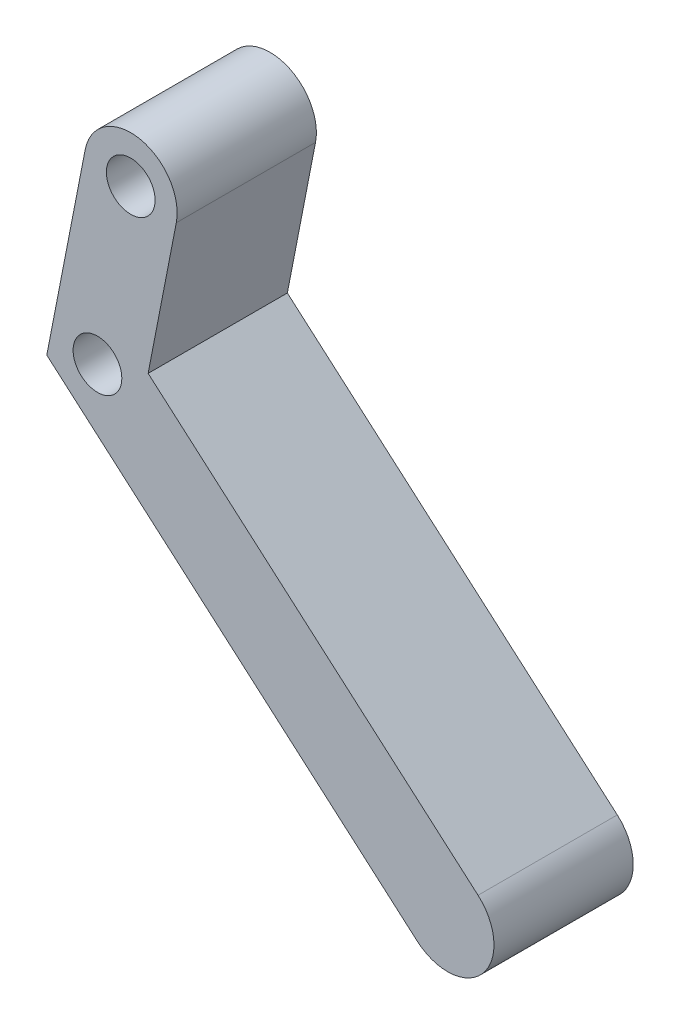
ISO-10303-21;
HEADER;
FILE_DESCRIPTION(('STEP AP214'),'2;1');
FILE_NAME('part.step','',(''),(''),'','','');
FILE_SCHEMA(('AUTOMOTIVE_DESIGN { 1 0 10303 214 1 1 1 1 }'));
ENDSEC;
DATA;
#1=APPLICATION_CONTEXT('core data for automotive mechanical design processes');
#2=APPLICATION_PROTOCOL_DEFINITION('international standard','automotive_design',2000,#1);
#3=PRODUCT_CONTEXT('',#1,'mechanical');
#4=PRODUCT('Part','Part','',(#3));
#5=PRODUCT_RELATED_PRODUCT_CATEGORY('part','',(#4));
#6=PRODUCT_DEFINITION_FORMATION('','',#4);
#7=PRODUCT_DEFINITION_CONTEXT('part definition',#1,'design');
#8=PRODUCT_DEFINITION('design','',#6,#7);
#9=PRODUCT_DEFINITION_SHAPE('','',#8);
#10=(LENGTH_UNIT() NAMED_UNIT(*) SI_UNIT(.MILLI.,.METRE.));
#11=(NAMED_UNIT(*) PLANE_ANGLE_UNIT() SI_UNIT($,.RADIAN.));
#12=(NAMED_UNIT(*) SI_UNIT($,.STERADIAN.) SOLID_ANGLE_UNIT());
#13=UNCERTAINTY_MEASURE_WITH_UNIT(LENGTH_MEASURE(1.E-05),#10,'distance_accuracy_value','');
#14=(GEOMETRIC_REPRESENTATION_CONTEXT(3) GLOBAL_UNCERTAINTY_ASSIGNED_CONTEXT((#13)) GLOBAL_UNIT_ASSIGNED_CONTEXT((#10,
#11,#12)) REPRESENTATION_CONTEXT('',''));
#15=CARTESIAN_POINT('',(0.,0.,0.));
#16=DIRECTION('',(0.,0.,1.));
#17=DIRECTION('',(1.,0.,0.));
#18=AXIS2_PLACEMENT_3D('',#15,#16,#17);
#19=CARTESIAN_POINT('',(80.6557787337688,-32.5877911499474,-6.));
#20=DIRECTION('',(-0.981551105812446,0.191199965163084,0.));
#21=DIRECTION('',(-0.191199965163084,-0.981551105812446,0.));
#22=AXIS2_PLACEMENT_3D('',#19,#20,#21);
#23=PLANE('',#22);
#24=DIRECTION('',(-0.191199965163084,-0.981551105812446,0.));
#25=VECTOR('',#24,1.);
#26=CARTESIAN_POINT('',(80.6557787337688,-32.5877911499474,0.));
#27=LINE('',#26,#25);
#28=CARTESIAN_POINT('',(80.6557787337688,-32.5877911499474,0.));
#29=VERTEX_POINT('',#28);
#30=CARTESIAN_POINT('',(79.0010002923337,-41.0828220338692,0.));
#31=VERTEX_POINT('',#30);
#32=EDGE_CURVE('E120',#29,#31,#27,.T.);
#33=ORIENTED_EDGE('',*,*,#32,.F.);
#34=DIRECTION('',(0.,0.,1.));
#35=VECTOR('',#34,1.);
#36=CARTESIAN_POINT('',(80.6557787337688,-32.5877911499474,-6.));
#37=LINE('',#36,#35);
#38=CARTESIAN_POINT('',(80.6557787337688,-32.5877911499474,-6.));
#39=VERTEX_POINT('',#38);
#40=EDGE_CURVE('E11',#39,#29,#37,.T.);
#41=ORIENTED_EDGE('',*,*,#40,.F.);
#42=DIRECTION('',(-0.191199965163084,-0.981551105812446,0.));
#43=VECTOR('',#42,1.);
#44=CARTESIAN_POINT('',(80.6557787337688,-32.5877911499474,-6.));
#45=LINE('',#44,#43);
#46=CARTESIAN_POINT('',(79.0010002923337,-41.0828220338692,-6.));
#47=VERTEX_POINT('',#46);
#48=EDGE_CURVE('E135',#39,#47,#45,.T.);
#49=ORIENTED_EDGE('',*,*,#48,.T.);
#50=DIRECTION('',(0.,0.,1.));
#51=VECTOR('',#50,1.);
#52=CARTESIAN_POINT('',(79.0010002923337,-41.0828220338692,-6.));
#53=LINE('',#52,#51);
#54=EDGE_CURVE('E84',#47,#31,#53,.T.);
#55=ORIENTED_EDGE('',*,*,#54,.T.);
#56=EDGE_LOOP('',(#33,#41,#49,#55));
#57=FACE_BOUND('',#56,.T.);
#58=ADVANCED_FACE('F34',(#57),#23,.T.);
#59=CARTESIAN_POINT('',(82.6188809453937,-32.9701910802736,-6.));
#60=DIRECTION('',(0.,0.,1.));
#61=DIRECTION('',(1.,0.,0.));
#62=AXIS2_PLACEMENT_3D('',#59,#60,#61);
#63=CYLINDRICAL_SURFACE('',#62,2.);
#64=CARTESIAN_POINT('',(82.6188809453937,-32.9701910802736,0.));
#65=DIRECTION('',(0.,0.,1.));
#66=DIRECTION('',(1.,0.,0.));
#67=AXIS2_PLACEMENT_3D('',#64,#65,#66);
#68=CIRCLE('',#67,2.);
#69=CARTESIAN_POINT('',(84.5819831570186,-33.3525910105998,0.));
#70=VERTEX_POINT('',#69);
#71=EDGE_CURVE('E133',#70,#29,#68,.T.);
#72=ORIENTED_EDGE('',*,*,#71,.F.);
#73=DIRECTION('',(0.,0.,1.));
#74=VECTOR('',#73,1.);
#75=CARTESIAN_POINT('',(84.5819831570186,-33.3525910105998,-6.));
#76=LINE('',#75,#74);
#77=CARTESIAN_POINT('',(84.5819831570186,-33.3525910105998,-6.));
#78=VERTEX_POINT('',#77);
#79=EDGE_CURVE('E43',#78,#70,#76,.T.);
#80=ORIENTED_EDGE('',*,*,#79,.F.);
#81=CARTESIAN_POINT('',(82.6188809453937,-32.9701910802736,-6.));
#82=DIRECTION('',(0.,0.,1.));
#83=DIRECTION('',(1.,0.,0.));
#84=AXIS2_PLACEMENT_3D('',#81,#82,#83);
#85=CIRCLE('',#84,2.);
#86=EDGE_CURVE('E110',#78,#39,#85,.T.);
#87=ORIENTED_EDGE('',*,*,#86,.T.);
#88=ORIENTED_EDGE('',*,*,#40,.T.);
#89=EDGE_LOOP('',(#72,#80,#87,#88));
#90=FACE_BOUND('',#89,.T.);
#91=ADVANCED_FACE('F158',(#90),#63,.T.);
#92=CARTESIAN_POINT('',(83.3687621210073,-39.5808267138648,-6.));
#93=DIRECTION('',(0.981551105812446,-0.191199965163083,0.));
#94=DIRECTION('',(0.191199965163083,0.981551105812446,0.));
#95=AXIS2_PLACEMENT_3D('',#92,#93,#94);
#96=PLANE('',#95);
#97=DIRECTION('',(0.191199965163083,0.981551105812446,0.));
#98=VECTOR('',#97,1.);
#99=CARTESIAN_POINT('',(83.3687621210073,-39.5808267138648,0.));
#100=LINE('',#99,#98);
#101=CARTESIAN_POINT('',(83.3687621210073,-39.5808267138648,0.));
#102=VERTEX_POINT('',#101);
#103=EDGE_CURVE('E97',#102,#70,#100,.T.);
#104=ORIENTED_EDGE('',*,*,#103,.F.);
#105=DIRECTION('',(0.,0.,1.));
#106=VECTOR('',#105,1.);
#107=CARTESIAN_POINT('',(83.3687621210073,-39.5808267138648,-6.));
#108=LINE('',#107,#106);
#109=CARTESIAN_POINT('',(83.3687621210073,-39.5808267138648,-6.));
#110=VERTEX_POINT('',#109);
#111=EDGE_CURVE('E92',#110,#102,#108,.T.);
#112=ORIENTED_EDGE('',*,*,#111,.F.);
#113=DIRECTION('',(0.191199965163083,0.981551105812446,0.));
#114=VECTOR('',#113,1.);
#115=CARTESIAN_POINT('',(83.3687621210073,-39.5808267138648,-6.));
#116=LINE('',#115,#114);
#117=EDGE_CURVE('E95',#110,#78,#116,.T.);
#118=ORIENTED_EDGE('',*,*,#117,.T.);
#119=ORIENTED_EDGE('',*,*,#79,.T.);
#120=EDGE_LOOP('',(#104,#112,#118,#119));
#121=FACE_BOUND('',#120,.T.);
#122=ADVANCED_FACE('F94',(#121),#96,.T.);
#123=CARTESIAN_POINT('',(97.5865645698457,-51.9501195523405,-6.));
#124=DIRECTION('',(0.656359579940151,0.754448210164746,0.));
#125=DIRECTION('',(-0.754448210164746,0.656359579940151,0.));
#126=AXIS2_PLACEMENT_3D('',#123,#124,#125);
#127=PLANE('',#126);
#128=DIRECTION('',(-0.754448210164746,0.656359579940151,0.));
#129=VECTOR('',#128,1.);
#130=CARTESIAN_POINT('',(97.5865645698457,-51.9501195523405,0.));
#131=LINE('',#130,#129);
#132=CARTESIAN_POINT('',(97.5865645698458,-51.9501195523405,0.));
#133=VERTEX_POINT('',#132);
#134=EDGE_CURVE('E130',#133,#102,#131,.T.);
#135=ORIENTED_EDGE('',*,*,#134,.F.);
#136=DIRECTION('',(0.,0.,1.));
#137=VECTOR('',#136,1.);
#138=CARTESIAN_POINT('',(97.5865645698458,-51.9501195523405,-6.));
#139=LINE('',#138,#137);
#140=CARTESIAN_POINT('',(97.5865645698458,-51.9501195523405,-6.));
#141=VERTEX_POINT('',#140);
#142=EDGE_CURVE('E102',#141,#133,#139,.T.);
#143=ORIENTED_EDGE('',*,*,#142,.F.);
#144=DIRECTION('',(-0.754448210164746,0.656359579940151,0.));
#145=VECTOR('',#144,1.);
#146=CARTESIAN_POINT('',(97.5865645698457,-51.9501195523405,-6.));
#147=LINE('',#146,#145);
#148=EDGE_CURVE('E108',#141,#110,#147,.T.);
#149=ORIENTED_EDGE('',*,*,#148,.T.);
#150=ORIENTED_EDGE('',*,*,#111,.T.);
#151=EDGE_LOOP('',(#135,#143,#149,#150));
#152=FACE_BOUND('',#151,.T.);
#153=ADVANCED_FACE('F112',(#152),#127,.T.);
#154=CARTESIAN_POINT('',(96.2738454099655,-53.45901597267,-6.));
#155=DIRECTION('',(0.,0.,1.));
#156=DIRECTION('',(1.,0.,0.));
#157=AXIS2_PLACEMENT_3D('',#154,#155,#156);
#158=CYLINDRICAL_SURFACE('',#157,2.);
#159=CARTESIAN_POINT('',(96.2738454099655,-53.45901597267,0.));
#160=DIRECTION('',(0.,0.,1.));
#161=DIRECTION('',(1.,0.,0.));
#162=AXIS2_PLACEMENT_3D('',#159,#160,#161);
#163=CIRCLE('',#162,2.);
#164=CARTESIAN_POINT('',(94.9611262500851,-54.9679123929995,0.));
#165=VERTEX_POINT('',#164);
#166=EDGE_CURVE('E127',#165,#133,#163,.T.);
#167=ORIENTED_EDGE('',*,*,#166,.F.);
#168=DIRECTION('',(0.,0.,1.));
#169=VECTOR('',#168,1.);
#170=CARTESIAN_POINT('',(94.9611262500851,-54.9679123929995,-6.));
#171=LINE('',#170,#169);
#172=CARTESIAN_POINT('',(94.9611262500851,-54.9679123929995,-6.));
#173=VERTEX_POINT('',#172);
#174=EDGE_CURVE('E139',#173,#165,#171,.T.);
#175=ORIENTED_EDGE('',*,*,#174,.F.);
#176=CARTESIAN_POINT('',(96.2738454099655,-53.45901597267,-6.));
#177=DIRECTION('',(0.,0.,1.));
#178=DIRECTION('',(1.,0.,0.));
#179=AXIS2_PLACEMENT_3D('',#176,#177,#178);
#180=CIRCLE('',#179,2.);
#181=EDGE_CURVE('E113',#173,#141,#180,.T.);
#182=ORIENTED_EDGE('',*,*,#181,.T.);
#183=ORIENTED_EDGE('',*,*,#142,.T.);
#184=EDGE_LOOP('',(#167,#175,#182,#183));
#185=FACE_BOUND('',#184,.T.);
#186=ADVANCED_FACE('F171',(#185),#158,.T.);
#187=CARTESIAN_POINT('',(79.0010002923337,-41.0828220338692,-6.));
#188=DIRECTION('',(-0.656359579940152,-0.754448210164745,0.));
#189=DIRECTION('',(0.754448210164745,-0.656359579940152,0.));
#190=AXIS2_PLACEMENT_3D('',#187,#188,#189);
#191=PLANE('',#190);
#192=DIRECTION('',(0.754448210164745,-0.656359579940152,0.));
#193=VECTOR('',#192,1.);
#194=CARTESIAN_POINT('',(79.0010002923337,-41.0828220338692,0.));
#195=LINE('',#194,#193);
#196=EDGE_CURVE('E123',#31,#165,#195,.T.);
#197=ORIENTED_EDGE('',*,*,#196,.F.);
#198=ORIENTED_EDGE('',*,*,#54,.F.);
#199=DIRECTION('',(0.754448210164745,-0.656359579940152,0.));
#200=VECTOR('',#199,1.);
#201=CARTESIAN_POINT('',(79.0010002923337,-41.0828220338692,-6.));
#202=LINE('',#201,#200);
#203=EDGE_CURVE('E115',#47,#173,#202,.T.);
#204=ORIENTED_EDGE('',*,*,#203,.T.);
#205=ORIENTED_EDGE('',*,*,#174,.T.);
#206=EDGE_LOOP('',(#197,#198,#204,#205));
#207=FACE_BOUND('',#206,.T.);
#208=ADVANCED_FACE('F154',(#207),#191,.T.);
#209=CARTESIAN_POINT('',(96.2738454099655,-53.45901597267,-6.));
#210=DIRECTION('',(0.,0.,1.));
#211=DIRECTION('',(1.,0.,0.));
#212=AXIS2_PLACEMENT_3D('',#209,#210,#211);
#213=PLANE('',#212);
#214=CARTESIAN_POINT('',(82.6188809453937,-32.9701910802736,-6.));
#215=DIRECTION('',(0.,0.,1.));
#216=DIRECTION('',(1.,0.,0.));
#217=AXIS2_PLACEMENT_3D('',#214,#215,#216);
#218=CIRCLE('',#217,1.04999999999999);
#219=CARTESIAN_POINT('',(83.6688809453937,-32.9701910802736,-6.));
#220=VERTEX_POINT('',#219);
#221=EDGE_CURVE('E124',#220,#220,#218,.T.);
#222=ORIENTED_EDGE('',*,*,#221,.T.);
#223=EDGE_LOOP('',(#222));
#224=FACE_BOUND('',#223,.T.);
#225=CARTESIAN_POINT('',(81.1848812066705,-40.331824373867,-6.));
#226=DIRECTION('',(0.,0.,1.));
#227=DIRECTION('',(1.,0.,0.));
#228=AXIS2_PLACEMENT_3D('',#225,#226,#227);
#229=CIRCLE('',#228,1.04999999999999);
#230=CARTESIAN_POINT('',(82.2348812066705,-40.331824373867,-6.));
#231=VERTEX_POINT('',#230);
#232=EDGE_CURVE('E143',#231,#231,#229,.T.);
#233=ORIENTED_EDGE('',*,*,#232,.T.);
#234=EDGE_LOOP('',(#233));
#235=FACE_BOUND('',#234,.T.);
#236=ORIENTED_EDGE('',*,*,#48,.F.);
#237=ORIENTED_EDGE('',*,*,#86,.F.);
#238=ORIENTED_EDGE('',*,*,#117,.F.);
#239=ORIENTED_EDGE('',*,*,#148,.F.);
#240=ORIENTED_EDGE('',*,*,#181,.F.);
#241=ORIENTED_EDGE('',*,*,#203,.F.);
#242=EDGE_LOOP('',(#236,#237,#238,#239,#240,#241));
#243=FACE_BOUND('',#242,.T.);
#244=ADVANCED_FACE('F106',(#224,#235,#243),#213,.F.);
#245=CARTESIAN_POINT('',(96.2738454099655,-53.45901597267,0.));
#246=DIRECTION('',(0.,0.,1.));
#247=DIRECTION('',(1.,0.,0.));
#248=AXIS2_PLACEMENT_3D('',#245,#246,#247);
#249=PLANE('',#248);
#250=CARTESIAN_POINT('',(82.6188809453937,-32.9701910802736,0.));
#251=DIRECTION('',(0.,0.,1.));
#252=DIRECTION('',(1.,0.,0.));
#253=AXIS2_PLACEMENT_3D('',#250,#251,#252);
#254=CIRCLE('',#253,1.04999999999999);
#255=CARTESIAN_POINT('',(83.6688809453937,-32.9701910802736,0.));
#256=VERTEX_POINT('',#255);
#257=EDGE_CURVE('E37',#256,#256,#254,.T.);
#258=ORIENTED_EDGE('',*,*,#257,.F.);
#259=EDGE_LOOP('',(#258));
#260=FACE_BOUND('',#259,.T.);
#261=CARTESIAN_POINT('',(81.1848812066705,-40.331824373867,0.));
#262=DIRECTION('',(0.,0.,1.));
#263=DIRECTION('',(1.,0.,0.));
#264=AXIS2_PLACEMENT_3D('',#261,#262,#263);
#265=CIRCLE('',#264,1.04999999999999);
#266=CARTESIAN_POINT('',(82.2348812066705,-40.331824373867,0.));
#267=VERTEX_POINT('',#266);
#268=EDGE_CURVE('E141',#267,#267,#265,.T.);
#269=ORIENTED_EDGE('',*,*,#268,.F.);
#270=EDGE_LOOP('',(#269));
#271=FACE_BOUND('',#270,.T.);
#272=ORIENTED_EDGE('',*,*,#32,.T.);
#273=ORIENTED_EDGE('',*,*,#196,.T.);
#274=ORIENTED_EDGE('',*,*,#166,.T.);
#275=ORIENTED_EDGE('',*,*,#134,.T.);
#276=ORIENTED_EDGE('',*,*,#103,.T.);
#277=ORIENTED_EDGE('',*,*,#71,.T.);
#278=EDGE_LOOP('',(#272,#273,#274,#275,#276,#277));
#279=FACE_BOUND('',#278,.T.);
#280=ADVANCED_FACE('F157',(#260,#271,#279),#249,.T.);
#281=CARTESIAN_POINT('',(81.1848812066705,-40.331824373867,-11.));
#282=DIRECTION('',(0.,0.,1.));
#283=DIRECTION('',(1.,0.,0.));
#284=AXIS2_PLACEMENT_3D('',#281,#282,#283);
#285=CYLINDRICAL_SURFACE('',#284,1.04999999999999);
#286=ORIENTED_EDGE('',*,*,#268,.T.);
#287=EDGE_LOOP('',(#286));
#288=FACE_BOUND('',#287,.T.);
#289=ORIENTED_EDGE('',*,*,#232,.F.);
#290=EDGE_LOOP('',(#289));
#291=FACE_BOUND('',#290,.T.);
#292=ADVANCED_FACE('F182',(#288,#291),#285,.F.);
#293=CARTESIAN_POINT('',(82.6188809453937,-32.9701910802736,-11.));
#294=DIRECTION('',(0.,0.,1.));
#295=DIRECTION('',(1.,0.,0.));
#296=AXIS2_PLACEMENT_3D('',#293,#294,#295);
#297=CYLINDRICAL_SURFACE('',#296,1.04999999999999);
#298=ORIENTED_EDGE('',*,*,#257,.T.);
#299=EDGE_LOOP('',(#298));
#300=FACE_BOUND('',#299,.T.);
#301=ORIENTED_EDGE('',*,*,#221,.F.);
#302=EDGE_LOOP('',(#301));
#303=FACE_BOUND('',#302,.T.);
#304=ADVANCED_FACE('F187',(#300,#303),#297,.F.);
#305=CLOSED_SHELL('',(#58,#91,#122,#153,#186,#208,#244,#280,#292,#304));
#306=MANIFOLD_SOLID_BREP('B2',#305);
#307=ADVANCED_BREP_SHAPE_REPRESENTATION('',(#18,#306),#14);
#308=SHAPE_DEFINITION_REPRESENTATION(#9,#307);
ENDSEC;
END-ISO-10303-21;
